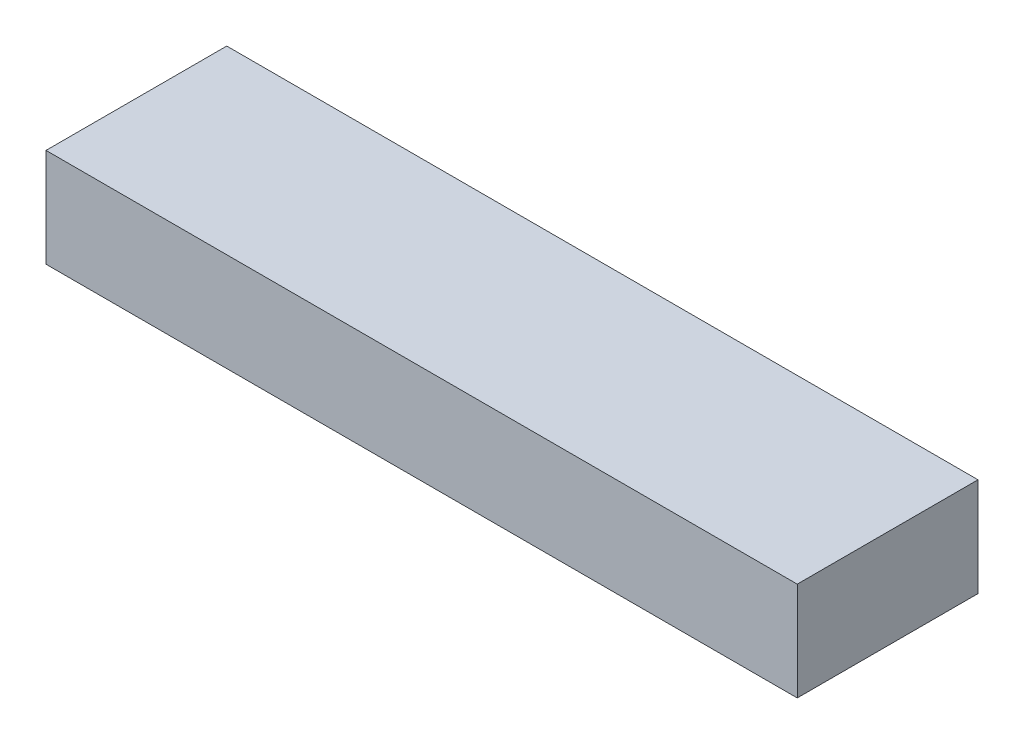
ISO-10303-21;
HEADER;
FILE_DESCRIPTION(('STEP AP214'),'2;1');
FILE_NAME('part.step','',(''),(''),'','','');
FILE_SCHEMA(('AUTOMOTIVE_DESIGN { 1 0 10303 214 1 1 1 1 }'));
ENDSEC;
DATA;
#1=APPLICATION_CONTEXT('core data for automotive mechanical design processes');
#2=APPLICATION_PROTOCOL_DEFINITION('international standard','automotive_design',2000,#1);
#3=PRODUCT_CONTEXT('',#1,'mechanical');
#4=PRODUCT('Part','Part','',(#3));
#5=PRODUCT_RELATED_PRODUCT_CATEGORY('part','',(#4));
#6=PRODUCT_DEFINITION_FORMATION('','',#4);
#7=PRODUCT_DEFINITION_CONTEXT('part definition',#1,'design');
#8=PRODUCT_DEFINITION('design','',#6,#7);
#9=PRODUCT_DEFINITION_SHAPE('','',#8);
#10=(LENGTH_UNIT() NAMED_UNIT(*) SI_UNIT(.MILLI.,.METRE.));
#11=(NAMED_UNIT(*) PLANE_ANGLE_UNIT() SI_UNIT($,.RADIAN.));
#12=(NAMED_UNIT(*) SI_UNIT($,.STERADIAN.) SOLID_ANGLE_UNIT());
#13=UNCERTAINTY_MEASURE_WITH_UNIT(LENGTH_MEASURE(1.E-05),#10,'distance_accuracy_value','');
#14=(GEOMETRIC_REPRESENTATION_CONTEXT(3) GLOBAL_UNCERTAINTY_ASSIGNED_CONTEXT((#13)) GLOBAL_UNIT_ASSIGNED_CONTEXT((#10,
#11,#12)) REPRESENTATION_CONTEXT('',''));
#15=CARTESIAN_POINT('',(0.,0.,0.));
#16=DIRECTION('',(0.,0.,1.));
#17=DIRECTION('',(1.,0.,0.));
#18=AXIS2_PLACEMENT_3D('',#15,#16,#17);
#19=CARTESIAN_POINT('',(-114.3,30.,27.5));
#20=DIRECTION('',(1.,0.,0.));
#21=DIRECTION('',(0.,0.,-1.));
#22=AXIS2_PLACEMENT_3D('',#19,#20,#21);
#23=PLANE('',#22);
#24=DIRECTION('',(0.,0.,1.));
#25=VECTOR('',#24,1.);
#26=CARTESIAN_POINT('',(-114.3,0.,27.5));
#27=LINE('',#26,#25);
#28=CARTESIAN_POINT('',(-114.3,0.,-27.5));
#29=VERTEX_POINT('',#28);
#30=CARTESIAN_POINT('',(-114.3,0.,27.5));
#31=VERTEX_POINT('',#30);
#32=EDGE_CURVE('E100',#29,#31,#27,.T.);
#33=ORIENTED_EDGE('',*,*,#32,.T.);
#34=DIRECTION('',(0.,-1.,0.));
#35=VECTOR('',#34,1.);
#36=CARTESIAN_POINT('',(-114.3,30.,27.5));
#37=LINE('',#36,#35);
#38=CARTESIAN_POINT('',(-114.3,30.,27.5));
#39=VERTEX_POINT('',#38);
#40=EDGE_CURVE('E11',#39,#31,#37,.T.);
#41=ORIENTED_EDGE('',*,*,#40,.F.);
#42=DIRECTION('',(0.,0.,1.));
#43=VECTOR('',#42,1.);
#44=CARTESIAN_POINT('',(-114.3,30.,27.5));
#45=LINE('',#44,#43);
#46=CARTESIAN_POINT('',(-114.3,30.,-27.5));
#47=VERTEX_POINT('',#46);
#48=EDGE_CURVE('E88',#47,#39,#45,.T.);
#49=ORIENTED_EDGE('',*,*,#48,.F.);
#50=DIRECTION('',(0.,-1.,0.));
#51=VECTOR('',#50,1.);
#52=CARTESIAN_POINT('',(-114.3,30.,-27.5));
#53=LINE('',#52,#51);
#54=EDGE_CURVE('E96',#47,#29,#53,.T.);
#55=ORIENTED_EDGE('',*,*,#54,.T.);
#56=EDGE_LOOP('',(#33,#41,#49,#55));
#57=FACE_BOUND('',#56,.T.);
#58=ADVANCED_FACE('F37',(#57),#23,.F.);
#59=CARTESIAN_POINT('',(114.3,30.,27.5));
#60=DIRECTION('',(0.,0.,-1.));
#61=DIRECTION('',(-1.,0.,0.));
#62=AXIS2_PLACEMENT_3D('',#59,#60,#61);
#63=PLANE('',#62);
#64=DIRECTION('',(1.,0.,0.));
#65=VECTOR('',#64,1.);
#66=CARTESIAN_POINT('',(114.3,0.,27.5));
#67=LINE('',#66,#65);
#68=CARTESIAN_POINT('',(114.3,0.,27.5));
#69=VERTEX_POINT('',#68);
#70=EDGE_CURVE('E92',#31,#69,#67,.T.);
#71=ORIENTED_EDGE('',*,*,#70,.T.);
#72=DIRECTION('',(0.,-1.,0.));
#73=VECTOR('',#72,1.);
#74=CARTESIAN_POINT('',(114.3,30.,27.5));
#75=LINE('',#74,#73);
#76=CARTESIAN_POINT('',(114.3,30.,27.5));
#77=VERTEX_POINT('',#76);
#78=EDGE_CURVE('E45',#77,#69,#75,.T.);
#79=ORIENTED_EDGE('',*,*,#78,.F.);
#80=DIRECTION('',(1.,0.,0.));
#81=VECTOR('',#80,1.);
#82=CARTESIAN_POINT('',(114.3,30.,27.5));
#83=LINE('',#82,#81);
#84=EDGE_CURVE('E83',#39,#77,#83,.T.);
#85=ORIENTED_EDGE('',*,*,#84,.F.);
#86=ORIENTED_EDGE('',*,*,#40,.T.);
#87=EDGE_LOOP('',(#71,#79,#85,#86));
#88=FACE_BOUND('',#87,.T.);
#89=ADVANCED_FACE('F91',(#88),#63,.F.);
#90=CARTESIAN_POINT('',(114.3,30.,27.5));
#91=DIRECTION('',(-1.,0.,0.));
#92=DIRECTION('',(0.,0.,1.));
#93=AXIS2_PLACEMENT_3D('',#90,#91,#92);
#94=PLANE('',#93);
#95=DIRECTION('',(0.,0.,-1.));
#96=VECTOR('',#95,1.);
#97=CARTESIAN_POINT('',(114.3,0.,27.5));
#98=LINE('',#97,#96);
#99=CARTESIAN_POINT('',(114.3,0.,-27.5));
#100=VERTEX_POINT('',#99);
#101=EDGE_CURVE('E70',#69,#100,#98,.T.);
#102=ORIENTED_EDGE('',*,*,#101,.T.);
#103=DIRECTION('',(0.,-1.,0.));
#104=VECTOR('',#103,1.);
#105=CARTESIAN_POINT('',(114.3,30.,-27.5));
#106=LINE('',#105,#104);
#107=CARTESIAN_POINT('',(114.3,30.,-27.5));
#108=VERTEX_POINT('',#107);
#109=EDGE_CURVE('E93',#108,#100,#106,.T.);
#110=ORIENTED_EDGE('',*,*,#109,.F.);
#111=DIRECTION('',(0.,0.,-1.));
#112=VECTOR('',#111,1.);
#113=CARTESIAN_POINT('',(114.3,30.,27.5));
#114=LINE('',#113,#112);
#115=EDGE_CURVE('E86',#77,#108,#114,.T.);
#116=ORIENTED_EDGE('',*,*,#115,.F.);
#117=ORIENTED_EDGE('',*,*,#78,.T.);
#118=EDGE_LOOP('',(#102,#110,#116,#117));
#119=FACE_BOUND('',#118,.T.);
#120=ADVANCED_FACE('F94',(#119),#94,.F.);
#121=CARTESIAN_POINT('',(114.3,30.,-27.5));
#122=DIRECTION('',(0.,0.,1.));
#123=DIRECTION('',(1.,0.,0.));
#124=AXIS2_PLACEMENT_3D('',#121,#122,#123);
#125=PLANE('',#124);
#126=DIRECTION('',(-1.,0.,0.));
#127=VECTOR('',#126,1.);
#128=CARTESIAN_POINT('',(114.3,0.,-27.5));
#129=LINE('',#128,#127);
#130=EDGE_CURVE('E76',#100,#29,#129,.T.);
#131=ORIENTED_EDGE('',*,*,#130,.T.);
#132=ORIENTED_EDGE('',*,*,#54,.F.);
#133=DIRECTION('',(-1.,0.,0.));
#134=VECTOR('',#133,1.);
#135=CARTESIAN_POINT('',(114.3,30.,-27.5));
#136=LINE('',#135,#134);
#137=EDGE_CURVE('E53',#108,#47,#136,.T.);
#138=ORIENTED_EDGE('',*,*,#137,.F.);
#139=ORIENTED_EDGE('',*,*,#109,.T.);
#140=EDGE_LOOP('',(#131,#132,#138,#139));
#141=FACE_BOUND('',#140,.T.);
#142=ADVANCED_FACE('F107',(#141),#125,.F.);
#143=CARTESIAN_POINT('',(0.,30.,0.));
#144=DIRECTION('',(0.,1.,0.));
#145=DIRECTION('',(0.,0.,1.));
#146=AXIS2_PLACEMENT_3D('',#143,#144,#145);
#147=PLANE('',#146);
#148=ORIENTED_EDGE('',*,*,#48,.T.);
#149=ORIENTED_EDGE('',*,*,#84,.T.);
#150=ORIENTED_EDGE('',*,*,#115,.T.);
#151=ORIENTED_EDGE('',*,*,#137,.T.);
#152=EDGE_LOOP('',(#148,#149,#150,#151));
#153=FACE_BOUND('',#152,.T.);
#154=ADVANCED_FACE('F84',(#153),#147,.T.);
#155=CARTESIAN_POINT('',(0.,0.,0.));
#156=DIRECTION('',(0.,1.,0.));
#157=DIRECTION('',(0.,0.,1.));
#158=AXIS2_PLACEMENT_3D('',#155,#156,#157);
#159=PLANE('',#158);
#160=ORIENTED_EDGE('',*,*,#32,.F.);
#161=ORIENTED_EDGE('',*,*,#130,.F.);
#162=ORIENTED_EDGE('',*,*,#101,.F.);
#163=ORIENTED_EDGE('',*,*,#70,.F.);
#164=EDGE_LOOP('',(#160,#161,#162,#163));
#165=FACE_BOUND('',#164,.T.);
#166=ADVANCED_FACE('F110',(#165),#159,.F.);
#167=CLOSED_SHELL('',(#58,#89,#120,#142,#154,#166));
#168=MANIFOLD_SOLID_BREP('B2',#167);
#169=ADVANCED_BREP_SHAPE_REPRESENTATION('',(#18,#168),#14);
#170=SHAPE_DEFINITION_REPRESENTATION(#9,#169);
ENDSEC;
END-ISO-10303-21;
